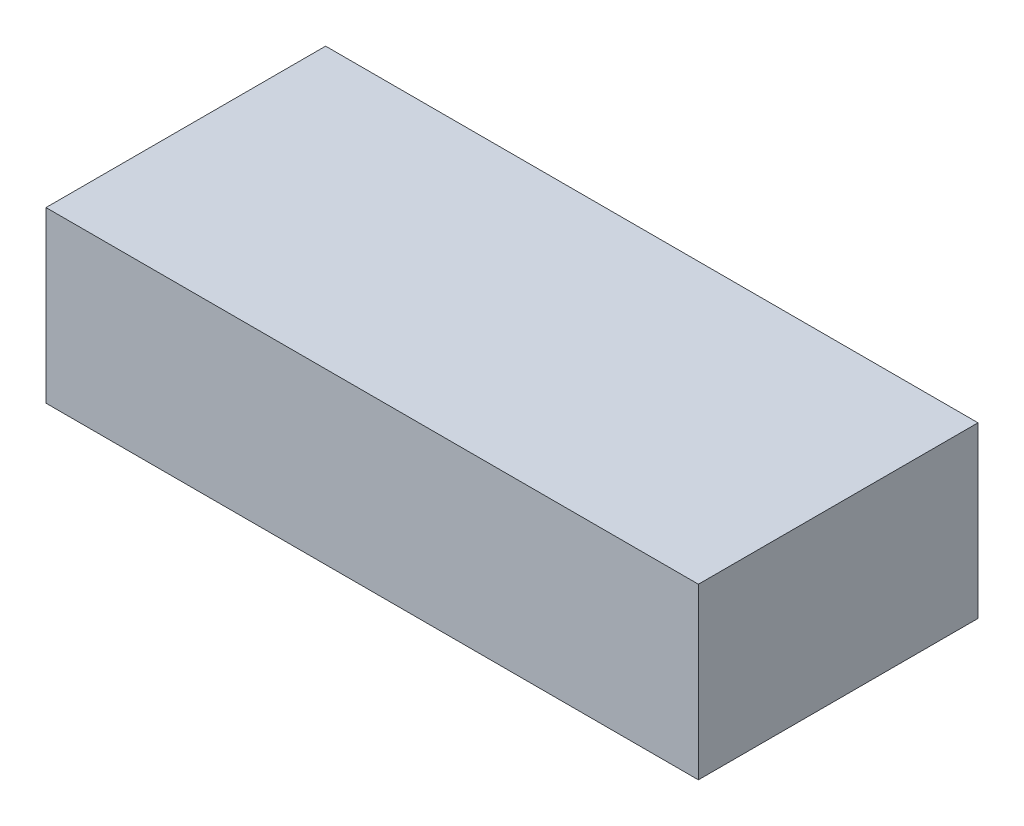
ISO-10303-21;
HEADER;
FILE_DESCRIPTION(('STEP AP214'),'2;1');
FILE_NAME('part.step','',(''),(''),'','','');
FILE_SCHEMA(('AUTOMOTIVE_DESIGN { 1 0 10303 214 1 1 1 1 }'));
ENDSEC;
DATA;
#1=APPLICATION_CONTEXT('core data for automotive mechanical design processes');
#2=APPLICATION_PROTOCOL_DEFINITION('international standard','automotive_design',2000,#1);
#3=PRODUCT_CONTEXT('',#1,'mechanical');
#4=PRODUCT('Part','Part','',(#3));
#5=PRODUCT_RELATED_PRODUCT_CATEGORY('part','',(#4));
#6=PRODUCT_DEFINITION_FORMATION('','',#4);
#7=PRODUCT_DEFINITION_CONTEXT('part definition',#1,'design');
#8=PRODUCT_DEFINITION('design','',#6,#7);
#9=PRODUCT_DEFINITION_SHAPE('','',#8);
#10=(LENGTH_UNIT() NAMED_UNIT(*) SI_UNIT(.MILLI.,.METRE.));
#11=(NAMED_UNIT(*) PLANE_ANGLE_UNIT() SI_UNIT($,.RADIAN.));
#12=(NAMED_UNIT(*) SI_UNIT($,.STERADIAN.) SOLID_ANGLE_UNIT());
#13=UNCERTAINTY_MEASURE_WITH_UNIT(LENGTH_MEASURE(1.E-05),#10,'distance_accuracy_value','');
#14=(GEOMETRIC_REPRESENTATION_CONTEXT(3) GLOBAL_UNCERTAINTY_ASSIGNED_CONTEXT((#13)) GLOBAL_UNIT_ASSIGNED_CONTEXT((#10,
#11,#12)) REPRESENTATION_CONTEXT('',''));
#15=CARTESIAN_POINT('',(0.,0.,0.));
#16=DIRECTION('',(0.,0.,1.));
#17=DIRECTION('',(1.,0.,0.));
#18=AXIS2_PLACEMENT_3D('',#15,#16,#17);
#19=CARTESIAN_POINT('',(0.,20.,0.));
#20=DIRECTION('',(1.,0.,0.));
#21=DIRECTION('',(0.,0.,-1.));
#22=AXIS2_PLACEMENT_3D('',#19,#20,#21);
#23=PLANE('',#22);
#24=DIRECTION('',(0.,0.,1.));
#25=VECTOR('',#24,1.);
#26=CARTESIAN_POINT('',(0.,0.,0.));
#27=LINE('',#26,#25);
#28=CARTESIAN_POINT('',(0.,0.,-33.));
#29=VERTEX_POINT('',#28);
#30=CARTESIAN_POINT('',(0.,0.,0.));
#31=VERTEX_POINT('',#30);
#32=EDGE_CURVE('E97',#29,#31,#27,.T.);
#33=ORIENTED_EDGE('',*,*,#32,.T.);
#34=DIRECTION('',(0.,-1.,0.));
#35=VECTOR('',#34,1.);
#36=CARTESIAN_POINT('',(0.,20.,0.));
#37=LINE('',#36,#35);
#38=CARTESIAN_POINT('',(0.,20.,0.));
#39=VERTEX_POINT('',#38);
#40=EDGE_CURVE('E11',#39,#31,#37,.T.);
#41=ORIENTED_EDGE('',*,*,#40,.F.);
#42=DIRECTION('',(0.,0.,1.));
#43=VECTOR('',#42,1.);
#44=CARTESIAN_POINT('',(0.,20.,0.));
#45=LINE('',#44,#43);
#46=CARTESIAN_POINT('',(0.,20.,-33.));
#47=VERTEX_POINT('',#46);
#48=EDGE_CURVE('E85',#47,#39,#45,.T.);
#49=ORIENTED_EDGE('',*,*,#48,.F.);
#50=DIRECTION('',(0.,-1.,0.));
#51=VECTOR('',#50,1.);
#52=CARTESIAN_POINT('',(0.,20.,-33.));
#53=LINE('',#52,#51);
#54=EDGE_CURVE('E93',#47,#29,#53,.T.);
#55=ORIENTED_EDGE('',*,*,#54,.T.);
#56=EDGE_LOOP('',(#33,#41,#49,#55));
#57=FACE_BOUND('',#56,.T.);
#58=ADVANCED_FACE('F34',(#57),#23,.F.);
#59=CARTESIAN_POINT('',(0.,20.,0.));
#60=DIRECTION('',(0.,0.,-1.));
#61=DIRECTION('',(-1.,0.,0.));
#62=AXIS2_PLACEMENT_3D('',#59,#60,#61);
#63=PLANE('',#62);
#64=DIRECTION('',(1.,0.,0.));
#65=VECTOR('',#64,1.);
#66=CARTESIAN_POINT('',(0.,0.,0.));
#67=LINE('',#66,#65);
#68=CARTESIAN_POINT('',(77.,0.,0.));
#69=VERTEX_POINT('',#68);
#70=EDGE_CURVE('E89',#31,#69,#67,.T.);
#71=ORIENTED_EDGE('',*,*,#70,.T.);
#72=DIRECTION('',(0.,-1.,0.));
#73=VECTOR('',#72,1.);
#74=CARTESIAN_POINT('',(77.,20.,0.));
#75=LINE('',#74,#73);
#76=CARTESIAN_POINT('',(77.,20.,0.));
#77=VERTEX_POINT('',#76);
#78=EDGE_CURVE('E42',#77,#69,#75,.T.);
#79=ORIENTED_EDGE('',*,*,#78,.F.);
#80=DIRECTION('',(1.,0.,0.));
#81=VECTOR('',#80,1.);
#82=CARTESIAN_POINT('',(0.,20.,0.));
#83=LINE('',#82,#81);
#84=EDGE_CURVE('E80',#39,#77,#83,.T.);
#85=ORIENTED_EDGE('',*,*,#84,.F.);
#86=ORIENTED_EDGE('',*,*,#40,.T.);
#87=EDGE_LOOP('',(#71,#79,#85,#86));
#88=FACE_BOUND('',#87,.T.);
#89=ADVANCED_FACE('F88',(#88),#63,.F.);
#90=CARTESIAN_POINT('',(77.,20.,0.));
#91=DIRECTION('',(-1.,0.,0.));
#92=DIRECTION('',(0.,0.,1.));
#93=AXIS2_PLACEMENT_3D('',#90,#91,#92);
#94=PLANE('',#93);
#95=DIRECTION('',(0.,0.,-1.));
#96=VECTOR('',#95,1.);
#97=CARTESIAN_POINT('',(77.,0.,0.));
#98=LINE('',#97,#96);
#99=CARTESIAN_POINT('',(77.,0.,-33.));
#100=VERTEX_POINT('',#99);
#101=EDGE_CURVE('E67',#69,#100,#98,.T.);
#102=ORIENTED_EDGE('',*,*,#101,.T.);
#103=DIRECTION('',(0.,-1.,0.));
#104=VECTOR('',#103,1.);
#105=CARTESIAN_POINT('',(77.,20.,-33.));
#106=LINE('',#105,#104);
#107=CARTESIAN_POINT('',(77.,20.,-33.));
#108=VERTEX_POINT('',#107);
#109=EDGE_CURVE('E90',#108,#100,#106,.T.);
#110=ORIENTED_EDGE('',*,*,#109,.F.);
#111=DIRECTION('',(0.,0.,-1.));
#112=VECTOR('',#111,1.);
#113=CARTESIAN_POINT('',(77.,20.,0.));
#114=LINE('',#113,#112);
#115=EDGE_CURVE('E83',#77,#108,#114,.T.);
#116=ORIENTED_EDGE('',*,*,#115,.F.);
#117=ORIENTED_EDGE('',*,*,#78,.T.);
#118=EDGE_LOOP('',(#102,#110,#116,#117));
#119=FACE_BOUND('',#118,.T.);
#120=ADVANCED_FACE('F91',(#119),#94,.F.);
#121=CARTESIAN_POINT('',(0.,20.,-33.));
#122=DIRECTION('',(0.,0.,1.));
#123=DIRECTION('',(1.,0.,0.));
#124=AXIS2_PLACEMENT_3D('',#121,#122,#123);
#125=PLANE('',#124);
#126=DIRECTION('',(-1.,0.,0.));
#127=VECTOR('',#126,1.);
#128=CARTESIAN_POINT('',(0.,0.,-33.));
#129=LINE('',#128,#127);
#130=EDGE_CURVE('E73',#100,#29,#129,.T.);
#131=ORIENTED_EDGE('',*,*,#130,.T.);
#132=ORIENTED_EDGE('',*,*,#54,.F.);
#133=DIRECTION('',(-1.,0.,0.));
#134=VECTOR('',#133,1.);
#135=CARTESIAN_POINT('',(0.,20.,-33.));
#136=LINE('',#135,#134);
#137=EDGE_CURVE('E50',#108,#47,#136,.T.);
#138=ORIENTED_EDGE('',*,*,#137,.F.);
#139=ORIENTED_EDGE('',*,*,#109,.T.);
#140=EDGE_LOOP('',(#131,#132,#138,#139));
#141=FACE_BOUND('',#140,.T.);
#142=ADVANCED_FACE('F104',(#141),#125,.F.);
#143=CARTESIAN_POINT('',(0.,20.,0.));
#144=DIRECTION('',(0.,-1.,0.));
#145=DIRECTION('',(0.,0.,-1.));
#146=AXIS2_PLACEMENT_3D('',#143,#144,#145);
#147=PLANE('',#146);
#148=ORIENTED_EDGE('',*,*,#48,.T.);
#149=ORIENTED_EDGE('',*,*,#84,.T.);
#150=ORIENTED_EDGE('',*,*,#115,.T.);
#151=ORIENTED_EDGE('',*,*,#137,.T.);
#152=EDGE_LOOP('',(#148,#149,#150,#151));
#153=FACE_BOUND('',#152,.T.);
#154=ADVANCED_FACE('F81',(#153),#147,.F.);
#155=CARTESIAN_POINT('',(0.,0.,0.));
#156=DIRECTION('',(0.,-1.,0.));
#157=DIRECTION('',(0.,0.,-1.));
#158=AXIS2_PLACEMENT_3D('',#155,#156,#157);
#159=PLANE('',#158);
#160=ORIENTED_EDGE('',*,*,#32,.F.);
#161=ORIENTED_EDGE('',*,*,#130,.F.);
#162=ORIENTED_EDGE('',*,*,#101,.F.);
#163=ORIENTED_EDGE('',*,*,#70,.F.);
#164=EDGE_LOOP('',(#160,#161,#162,#163));
#165=FACE_BOUND('',#164,.T.);
#166=ADVANCED_FACE('F107',(#165),#159,.T.);
#167=CLOSED_SHELL('',(#58,#89,#120,#142,#154,#166));
#168=MANIFOLD_SOLID_BREP('B2',#167);
#169=ADVANCED_BREP_SHAPE_REPRESENTATION('',(#18,#168),#14);
#170=SHAPE_DEFINITION_REPRESENTATION(#9,#169);
ENDSEC;
END-ISO-10303-21;
